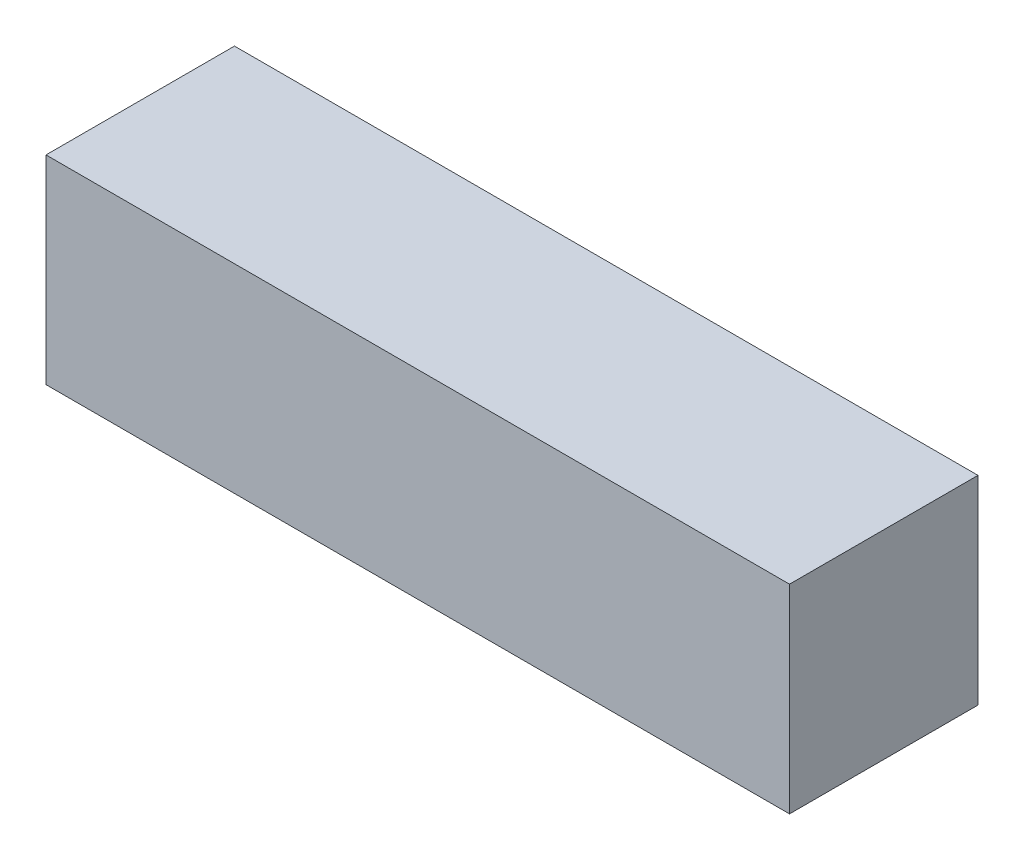
ISO-10303-21;
HEADER;
FILE_DESCRIPTION(('STEP AP214'),'2;1');
FILE_NAME('part.step','',(''),(''),'','','');
FILE_SCHEMA(('AUTOMOTIVE_DESIGN { 1 0 10303 214 1 1 1 1 }'));
ENDSEC;
DATA;
#1=APPLICATION_CONTEXT('core data for automotive mechanical design processes');
#2=APPLICATION_PROTOCOL_DEFINITION('international standard','automotive_design',2000,#1);
#3=PRODUCT_CONTEXT('',#1,'mechanical');
#4=PRODUCT('Part','Part','',(#3));
#5=PRODUCT_RELATED_PRODUCT_CATEGORY('part','',(#4));
#6=PRODUCT_DEFINITION_FORMATION('','',#4);
#7=PRODUCT_DEFINITION_CONTEXT('part definition',#1,'design');
#8=PRODUCT_DEFINITION('design','',#6,#7);
#9=PRODUCT_DEFINITION_SHAPE('','',#8);
#10=(LENGTH_UNIT() NAMED_UNIT(*) SI_UNIT(.MILLI.,.METRE.));
#11=(NAMED_UNIT(*) PLANE_ANGLE_UNIT() SI_UNIT($,.RADIAN.));
#12=(NAMED_UNIT(*) SI_UNIT($,.STERADIAN.) SOLID_ANGLE_UNIT());
#13=UNCERTAINTY_MEASURE_WITH_UNIT(LENGTH_MEASURE(1.E-05),#10,'distance_accuracy_value','');
#14=(GEOMETRIC_REPRESENTATION_CONTEXT(3) GLOBAL_UNCERTAINTY_ASSIGNED_CONTEXT((#13)) GLOBAL_UNIT_ASSIGNED_CONTEXT((#10,
#11,#12)) REPRESENTATION_CONTEXT('',''));
#15=CARTESIAN_POINT('',(0.,0.,0.));
#16=DIRECTION('',(0.,0.,1.));
#17=DIRECTION('',(1.,0.,0.));
#18=AXIS2_PLACEMENT_3D('',#15,#16,#17);
#19=CARTESIAN_POINT('',(-1.77500026,-0.47499778,0.90000074));
#20=DIRECTION('',(0.,0.,-1.));
#21=DIRECTION('',(-1.,0.,0.));
#22=AXIS2_PLACEMENT_3D('',#19,#20,#21);
#23=PLANE('',#22);
#24=DIRECTION('',(0.,1.,0.));
#25=VECTOR('',#24,1.);
#26=CARTESIAN_POINT('',(1.77500026,-0.47499778,0.90000074));
#27=LINE('',#26,#25);
#28=CARTESIAN_POINT('',(1.77500026,0.47500032,0.90000074));
#29=VERTEX_POINT('',#28);
#30=CARTESIAN_POINT('',(1.77500026,-0.47499778,0.90000074));
#31=VERTEX_POINT('',#30);
#32=EDGE_CURVE('E20',#29,#31,#27,.F.);
#33=ORIENTED_EDGE('',*,*,#32,.F.);
#34=DIRECTION('',(1.,0.,0.));
#35=VECTOR('',#34,1.);
#36=CARTESIAN_POINT('',(1.77500026,0.47500032,0.90000074));
#37=LINE('',#36,#35);
#38=CARTESIAN_POINT('',(-1.77500026,0.47500032,0.90000074));
#39=VERTEX_POINT('',#38);
#40=EDGE_CURVE('E55',#29,#39,#37,.F.);
#41=ORIENTED_EDGE('',*,*,#40,.T.);
#42=DIRECTION('',(0.,1.,0.));
#43=VECTOR('',#42,1.);
#44=CARTESIAN_POINT('',(-1.77500026,0.47500032,0.90000074));
#45=LINE('',#44,#43);
#46=CARTESIAN_POINT('',(-1.77500026,-0.47499778,0.90000074));
#47=VERTEX_POINT('',#46);
#48=EDGE_CURVE('E58',#39,#47,#45,.F.);
#49=ORIENTED_EDGE('',*,*,#48,.T.);
#50=DIRECTION('',(1.,0.,0.));
#51=VECTOR('',#50,1.);
#52=CARTESIAN_POINT('',(-1.77500026,-0.47499778,0.90000074));
#53=LINE('',#52,#51);
#54=EDGE_CURVE('E60',#47,#31,#53,.T.);
#55=ORIENTED_EDGE('',*,*,#54,.T.);
#56=EDGE_LOOP('',(#33,#41,#49,#55));
#57=FACE_BOUND('',#56,.T.);
#58=ADVANCED_FACE('F17',(#57),#23,.F.);
#59=CARTESIAN_POINT('',(-1.77500026,-0.47499778,0.));
#60=DIRECTION('',(0.,1.,0.));
#61=DIRECTION('',(0.,0.,1.));
#62=AXIS2_PLACEMENT_3D('',#59,#60,#61);
#63=PLANE('',#62);
#64=DIRECTION('',(-1.,0.,0.));
#65=VECTOR('',#64,1.);
#66=CARTESIAN_POINT('',(-1.77500026,-0.47499778,0.));
#67=LINE('',#66,#65);
#68=CARTESIAN_POINT('',(1.77500026,-0.47499778,0.));
#69=VERTEX_POINT('',#68);
#70=CARTESIAN_POINT('',(-1.77500026,-0.47499778,0.));
#71=VERTEX_POINT('',#70);
#72=EDGE_CURVE('E83',#69,#71,#67,.T.);
#73=ORIENTED_EDGE('',*,*,#72,.F.);
#74=DIRECTION('',(0.,0.,1.));
#75=VECTOR('',#74,1.);
#76=CARTESIAN_POINT('',(1.77500026,-0.47499778,0.));
#77=LINE('',#76,#75);
#78=EDGE_CURVE('E71',#69,#31,#77,.T.);
#79=ORIENTED_EDGE('',*,*,#78,.T.);
#80=ORIENTED_EDGE('',*,*,#54,.F.);
#81=DIRECTION('',(0.,0.,-1.));
#82=VECTOR('',#81,1.);
#83=CARTESIAN_POINT('',(-1.77500026,-0.47499778,0.));
#84=LINE('',#83,#82);
#85=EDGE_CURVE('E65',#47,#71,#84,.T.);
#86=ORIENTED_EDGE('',*,*,#85,.T.);
#87=EDGE_LOOP('',(#73,#79,#80,#86));
#88=FACE_BOUND('',#87,.T.);
#89=ADVANCED_FACE('F68',(#88),#63,.F.);
#90=CARTESIAN_POINT('',(-1.77500026,0.47500032,0.));
#91=DIRECTION('',(1.,0.,0.));
#92=DIRECTION('',(0.,0.,-1.));
#93=AXIS2_PLACEMENT_3D('',#90,#91,#92);
#94=PLANE('',#93);
#95=DIRECTION('',(0.,1.,0.));
#96=VECTOR('',#95,1.);
#97=CARTESIAN_POINT('',(-1.77500026,-0.47499778,0.));
#98=LINE('',#97,#96);
#99=CARTESIAN_POINT('',(-1.77500026,0.47500032,0.));
#100=VERTEX_POINT('',#99);
#101=EDGE_CURVE('E74',#71,#100,#98,.T.);
#102=ORIENTED_EDGE('',*,*,#101,.F.);
#103=ORIENTED_EDGE('',*,*,#85,.F.);
#104=ORIENTED_EDGE('',*,*,#48,.F.);
#105=DIRECTION('',(0.,0.,-1.));
#106=VECTOR('',#105,1.);
#107=CARTESIAN_POINT('',(-1.77500026,0.47500032,0.));
#108=LINE('',#107,#106);
#109=EDGE_CURVE('E77',#39,#100,#108,.T.);
#110=ORIENTED_EDGE('',*,*,#109,.T.);
#111=EDGE_LOOP('',(#102,#103,#104,#110));
#112=FACE_BOUND('',#111,.T.);
#113=ADVANCED_FACE('F72',(#112),#94,.F.);
#114=CARTESIAN_POINT('',(1.77500026,0.47500032,0.));
#115=DIRECTION('',(0.,-1.,0.));
#116=DIRECTION('',(0.,0.,-1.));
#117=AXIS2_PLACEMENT_3D('',#114,#115,#116);
#118=PLANE('',#117);
#119=DIRECTION('',(-1.,0.,0.));
#120=VECTOR('',#119,1.);
#121=CARTESIAN_POINT('',(-1.77500026,0.47500032,0.));
#122=LINE('',#121,#120);
#123=CARTESIAN_POINT('',(1.77500026,0.47500032,0.));
#124=VERTEX_POINT('',#123);
#125=EDGE_CURVE('E26',#100,#124,#122,.F.);
#126=ORIENTED_EDGE('',*,*,#125,.F.);
#127=ORIENTED_EDGE('',*,*,#109,.F.);
#128=ORIENTED_EDGE('',*,*,#40,.F.);
#129=DIRECTION('',(0.,0.,1.));
#130=VECTOR('',#129,1.);
#131=CARTESIAN_POINT('',(1.77500026,0.47500032,0.));
#132=LINE('',#131,#130);
#133=EDGE_CURVE('E35',#29,#124,#132,.F.);
#134=ORIENTED_EDGE('',*,*,#133,.T.);
#135=EDGE_LOOP('',(#126,#127,#128,#134));
#136=FACE_BOUND('',#135,.T.);
#137=ADVANCED_FACE('F89',(#136),#118,.F.);
#138=CARTESIAN_POINT('',(1.77500026,-0.47499778,0.));
#139=DIRECTION('',(-1.,0.,0.));
#140=DIRECTION('',(0.,0.,1.));
#141=AXIS2_PLACEMENT_3D('',#138,#139,#140);
#142=PLANE('',#141);
#143=DIRECTION('',(0.,1.,0.));
#144=VECTOR('',#143,1.);
#145=CARTESIAN_POINT('',(1.77500026,-0.47499778,0.));
#146=LINE('',#145,#144);
#147=EDGE_CURVE('E11',#124,#69,#146,.F.);
#148=ORIENTED_EDGE('',*,*,#147,.F.);
#149=ORIENTED_EDGE('',*,*,#133,.F.);
#150=ORIENTED_EDGE('',*,*,#32,.T.);
#151=ORIENTED_EDGE('',*,*,#78,.F.);
#152=EDGE_LOOP('',(#148,#149,#150,#151));
#153=FACE_BOUND('',#152,.T.);
#154=ADVANCED_FACE('F91',(#153),#142,.F.);
#155=CARTESIAN_POINT('',(-1.77500026,-0.47499778,0.));
#156=DIRECTION('',(0.,0.,-1.));
#157=DIRECTION('',(-1.,0.,0.));
#158=AXIS2_PLACEMENT_3D('',#155,#156,#157);
#159=PLANE('',#158);
#160=ORIENTED_EDGE('',*,*,#125,.T.);
#161=ORIENTED_EDGE('',*,*,#147,.T.);
#162=ORIENTED_EDGE('',*,*,#72,.T.);
#163=ORIENTED_EDGE('',*,*,#101,.T.);
#164=EDGE_LOOP('',(#160,#161,#162,#163));
#165=FACE_BOUND('',#164,.T.);
#166=ADVANCED_FACE('F88',(#165),#159,.T.);
#167=CLOSED_SHELL('',(#58,#89,#113,#137,#154,#166));
#168=MANIFOLD_SOLID_BREP('B1',#167);
#169=ADVANCED_BREP_SHAPE_REPRESENTATION('',(#18,#168),#14);
#170=SHAPE_DEFINITION_REPRESENTATION(#9,#169);
ENDSEC;
END-ISO-10303-21;
